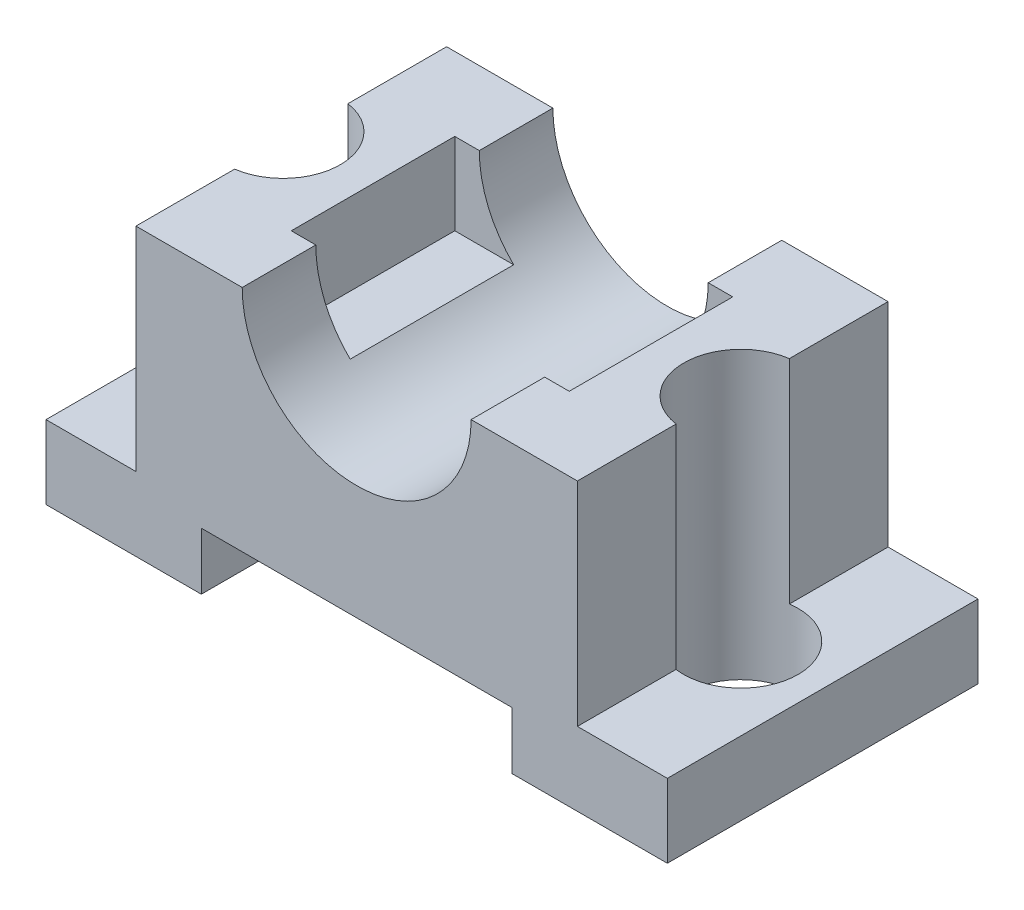
ISO-10303-21;
HEADER;
FILE_DESCRIPTION(('STEP AP214'),'2;1');
FILE_NAME('part.step','',(''),(''),'','','');
FILE_SCHEMA(('AUTOMOTIVE_DESIGN { 1 0 10303 214 1 1 1 1 }'));
ENDSEC;
DATA;
#1=APPLICATION_CONTEXT('core data for automotive mechanical design processes');
#2=APPLICATION_PROTOCOL_DEFINITION('international standard','automotive_design',2000,#1);
#3=PRODUCT_CONTEXT('',#1,'mechanical');
#4=PRODUCT('Part','Part','',(#3));
#5=PRODUCT_RELATED_PRODUCT_CATEGORY('part','',(#4));
#6=PRODUCT_DEFINITION_FORMATION('','',#4);
#7=PRODUCT_DEFINITION_CONTEXT('part definition',#1,'design');
#8=PRODUCT_DEFINITION('design','',#6,#7);
#9=PRODUCT_DEFINITION_SHAPE('','',#8);
#10=(LENGTH_UNIT() NAMED_UNIT(*) SI_UNIT(.MILLI.,.METRE.));
#11=(NAMED_UNIT(*) PLANE_ANGLE_UNIT() SI_UNIT($,.RADIAN.));
#12=(NAMED_UNIT(*) SI_UNIT($,.STERADIAN.) SOLID_ANGLE_UNIT());
#13=UNCERTAINTY_MEASURE_WITH_UNIT(LENGTH_MEASURE(1.E-05),#10,'distance_accuracy_value','');
#14=(GEOMETRIC_REPRESENTATION_CONTEXT(3) GLOBAL_UNCERTAINTY_ASSIGNED_CONTEXT((#13)) GLOBAL_UNIT_ASSIGNED_CONTEXT((#10,
#11,#12)) REPRESENTATION_CONTEXT('',''));
#15=CARTESIAN_POINT('',(0.,0.,0.));
#16=DIRECTION('',(0.,0.,1.));
#17=DIRECTION('',(1.,0.,0.));
#18=AXIS2_PLACEMENT_3D('',#15,#16,#17);
#19=CARTESIAN_POINT('',(0.,35.,19.));
#20=DIRECTION('',(0.,0.,-1.));
#21=DIRECTION('',(-1.,0.,0.));
#22=AXIS2_PLACEMENT_3D('',#19,#20,#21);
#23=CYLINDRICAL_SURFACE('',#22,14.);
#24=DIRECTION('',(0.,0.,-1.));
#25=VECTOR('',#24,1.);
#26=CARTESIAN_POINT('',(-14.,35.,19.));
#27=LINE('',#26,#25);
#28=CARTESIAN_POINT('',(-14.,35.,-10.));
#29=VERTEX_POINT('',#28);
#30=CARTESIAN_POINT('',(-14.,35.,-19.));
#31=VERTEX_POINT('',#30);
#32=EDGE_CURVE('E469',#29,#31,#27,.T.);
#33=ORIENTED_EDGE('',*,*,#32,.F.);
#34=CARTESIAN_POINT('',(0.,35.,-10.));
#35=DIRECTION('',(0.,0.,1.));
#36=DIRECTION('',(1.,0.,0.));
#37=AXIS2_PLACEMENT_3D('',#34,#35,#36);
#38=CIRCLE('',#37,14.);
#39=CARTESIAN_POINT('',(-9.79795897113273,25.,-10.));
#40=VERTEX_POINT('',#39);
#41=EDGE_CURVE('E276',#29,#40,#38,.T.);
#42=ORIENTED_EDGE('',*,*,#41,.T.);
#43=DIRECTION('',(0.,0.,-1.));
#44=VECTOR('',#43,1.);
#45=CARTESIAN_POINT('',(-9.79795897113273,25.,19.));
#46=LINE('',#45,#44);
#47=CARTESIAN_POINT('',(-9.79795897113273,25.,9.99999999999999));
#48=VERTEX_POINT('',#47);
#49=EDGE_CURVE('E11',#48,#40,#46,.T.);
#50=ORIENTED_EDGE('',*,*,#49,.F.);
#51=CARTESIAN_POINT('',(0.,35.,9.99999999999999));
#52=DIRECTION('',(0.,0.,-1.));
#53=DIRECTION('',(-1.,0.,0.));
#54=AXIS2_PLACEMENT_3D('',#51,#52,#53);
#55=CIRCLE('',#54,14.);
#56=CARTESIAN_POINT('',(-14.,35.,9.99999999999999));
#57=VERTEX_POINT('',#56);
#58=EDGE_CURVE('E269',#48,#57,#55,.T.);
#59=ORIENTED_EDGE('',*,*,#58,.T.);
#60=CARTESIAN_POINT('',(-14.,35.,19.));
#61=VERTEX_POINT('',#60);
#62=EDGE_CURVE('E470',#61,#57,#27,.T.);
#63=ORIENTED_EDGE('',*,*,#62,.F.);
#64=CARTESIAN_POINT('',(0.,35.,19.));
#65=DIRECTION('',(0.,0.,1.));
#66=DIRECTION('',(1.,0.,0.));
#67=AXIS2_PLACEMENT_3D('',#64,#65,#66);
#68=CIRCLE('',#67,14.);
#69=CARTESIAN_POINT('',(14.,35.,19.));
#70=VERTEX_POINT('',#69);
#71=EDGE_CURVE('E316',#61,#70,#68,.T.);
#72=ORIENTED_EDGE('',*,*,#71,.T.);
#73=DIRECTION('',(0.,0.,-1.));
#74=VECTOR('',#73,1.);
#75=CARTESIAN_POINT('',(14.,35.,19.));
#76=LINE('',#75,#74);
#77=CARTESIAN_POINT('',(14.,35.,9.99999999999999));
#78=VERTEX_POINT('',#77);
#79=EDGE_CURVE('E419',#70,#78,#76,.T.);
#80=ORIENTED_EDGE('',*,*,#79,.T.);
#81=CARTESIAN_POINT('',(9.79795897113272,25.,9.99999999999999));
#82=VERTEX_POINT('',#81);
#83=EDGE_CURVE('E70',#78,#82,#55,.T.);
#84=ORIENTED_EDGE('',*,*,#83,.T.);
#85=DIRECTION('',(0.,0.,-1.));
#86=VECTOR('',#85,1.);
#87=CARTESIAN_POINT('',(9.79795897113272,25.,19.));
#88=LINE('',#87,#86);
#89=CARTESIAN_POINT('',(9.79795897113272,25.,-10.));
#90=VERTEX_POINT('',#89);
#91=EDGE_CURVE('E55',#90,#82,#88,.F.);
#92=ORIENTED_EDGE('',*,*,#91,.F.);
#93=CARTESIAN_POINT('',(14.,35.,-10.));
#94=VERTEX_POINT('',#93);
#95=EDGE_CURVE('E237',#90,#94,#38,.T.);
#96=ORIENTED_EDGE('',*,*,#95,.T.);
#97=CARTESIAN_POINT('',(14.,35.,-19.));
#98=VERTEX_POINT('',#97);
#99=EDGE_CURVE('E366',#94,#98,#76,.T.);
#100=ORIENTED_EDGE('',*,*,#99,.T.);
#101=CARTESIAN_POINT('',(0.,35.,-19.));
#102=DIRECTION('',(0.,0.,1.));
#103=DIRECTION('',(1.,0.,0.));
#104=AXIS2_PLACEMENT_3D('',#101,#102,#103);
#105=CIRCLE('',#104,14.);
#106=EDGE_CURVE('E315',#31,#98,#105,.T.);
#107=ORIENTED_EDGE('',*,*,#106,.F.);
#108=EDGE_LOOP('',(#33,#42,#50,#59,#63,#72,#80,#84,#92,#96,#100,#107));
#109=FACE_BOUND('',#108,.T.);
#110=ADVANCED_FACE('F47',(#109),#23,.F.);
#111=CARTESIAN_POINT('',(0.,35.,19.));
#112=DIRECTION('',(0.,1.,0.));
#113=DIRECTION('',(-1.,0.,0.));
#114=AXIS2_PLACEMENT_3D('',#111,#112,#113);
#115=PLANE('',#114);
#116=DIRECTION('',(0.,0.,-1.));
#117=VECTOR('',#116,1.);
#118=CARTESIAN_POINT('',(-17.,35.,19.));
#119=LINE('',#118,#117);
#120=CARTESIAN_POINT('',(-17.,35.,9.99999999999999));
#121=VERTEX_POINT('',#120);
#122=CARTESIAN_POINT('',(-17.,35.,-10.));
#123=VERTEX_POINT('',#122);
#124=EDGE_CURVE('E482',#121,#123,#119,.T.);
#125=ORIENTED_EDGE('',*,*,#124,.T.);
#126=DIRECTION('',(1.,0.,0.));
#127=VECTOR('',#126,1.);
#128=CARTESIAN_POINT('',(0.,35.,-10.));
#129=LINE('',#128,#127);
#130=EDGE_CURVE('E275',#123,#29,#129,.T.);
#131=ORIENTED_EDGE('',*,*,#130,.T.);
#132=ORIENTED_EDGE('',*,*,#32,.T.);
#133=DIRECTION('',(1.,0.,0.));
#134=VECTOR('',#133,1.);
#135=CARTESIAN_POINT('',(0.,35.,-19.));
#136=LINE('',#135,#134);
#137=CARTESIAN_POINT('',(-27.,35.,-19.));
#138=VERTEX_POINT('',#137);
#139=EDGE_CURVE('E370',#138,#31,#136,.T.);
#140=ORIENTED_EDGE('',*,*,#139,.F.);
#141=DIRECTION('',(0.,0.,-1.));
#142=VECTOR('',#141,1.);
#143=CARTESIAN_POINT('',(-27.,35.,19.));
#144=LINE('',#143,#142);
#145=CARTESIAN_POINT('',(-27.,35.,-6.92820323027551));
#146=VERTEX_POINT('',#145);
#147=EDGE_CURVE('E464',#146,#138,#144,.T.);
#148=ORIENTED_EDGE('',*,*,#147,.F.);
#149=CARTESIAN_POINT('',(-28.,35.,0.));
#150=DIRECTION('',(0.,1.,0.));
#151=DIRECTION('',(0.,0.,-1.));
#152=AXIS2_PLACEMENT_3D('',#149,#150,#151);
#153=CIRCLE('',#152,7.);
#154=CARTESIAN_POINT('',(-27.,35.,6.92820323027551));
#155=VERTEX_POINT('',#154);
#156=EDGE_CURVE('E284',#155,#146,#153,.T.);
#157=ORIENTED_EDGE('',*,*,#156,.F.);
#158=CARTESIAN_POINT('',(-27.,35.,19.));
#159=VERTEX_POINT('',#158);
#160=EDGE_CURVE('E465',#159,#155,#144,.T.);
#161=ORIENTED_EDGE('',*,*,#160,.F.);
#162=DIRECTION('',(1.,0.,0.));
#163=VECTOR('',#162,1.);
#164=CARTESIAN_POINT('',(0.,35.,19.));
#165=LINE('',#164,#163);
#166=EDGE_CURVE('E320',#159,#61,#165,.T.);
#167=ORIENTED_EDGE('',*,*,#166,.T.);
#168=ORIENTED_EDGE('',*,*,#62,.T.);
#169=DIRECTION('',(-1.,0.,0.));
#170=VECTOR('',#169,1.);
#171=CARTESIAN_POINT('',(0.,35.,9.99999999999999));
#172=LINE('',#171,#170);
#173=EDGE_CURVE('E268',#57,#121,#172,.T.);
#174=ORIENTED_EDGE('',*,*,#173,.T.);
#175=EDGE_LOOP('',(#125,#131,#132,#140,#148,#157,#161,#167,#168,#174));
#176=FACE_BOUND('',#175,.T.);
#177=ADVANCED_FACE('F509',(#176),#115,.T.);
#178=CARTESIAN_POINT('',(0.,35.,19.));
#179=DIRECTION('',(0.,-1.,0.));
#180=DIRECTION('',(1.,0.,0.));
#181=AXIS2_PLACEMENT_3D('',#178,#179,#180);
#182=PLANE('',#181);
#183=DIRECTION('',(-1.,0.,0.));
#184=VECTOR('',#183,1.);
#185=CARTESIAN_POINT('',(0.,35.,-10.));
#186=LINE('',#185,#184);
#187=CARTESIAN_POINT('',(17.,35.,-10.));
#188=VERTEX_POINT('',#187);
#189=EDGE_CURVE('E479',#188,#94,#186,.T.);
#190=ORIENTED_EDGE('',*,*,#189,.F.);
#191=DIRECTION('',(0.,0.,-1.));
#192=VECTOR('',#191,1.);
#193=CARTESIAN_POINT('',(17.,35.,19.));
#194=LINE('',#193,#192);
#195=CARTESIAN_POINT('',(17.,35.,9.99999999999999));
#196=VERTEX_POINT('',#195);
#197=EDGE_CURVE('E227',#196,#188,#194,.T.);
#198=ORIENTED_EDGE('',*,*,#197,.F.);
#199=DIRECTION('',(1.,0.,0.));
#200=VECTOR('',#199,1.);
#201=CARTESIAN_POINT('',(0.,35.,9.99999999999999));
#202=LINE('',#201,#200);
#203=EDGE_CURVE('E474',#78,#196,#202,.T.);
#204=ORIENTED_EDGE('',*,*,#203,.F.);
#205=ORIENTED_EDGE('',*,*,#79,.F.);
#206=DIRECTION('',(-1.,0.,0.));
#207=VECTOR('',#206,1.);
#208=CARTESIAN_POINT('',(0.,35.,19.));
#209=LINE('',#208,#207);
#210=CARTESIAN_POINT('',(27.,35.,19.));
#211=VERTEX_POINT('',#210);
#212=EDGE_CURVE('E363',#211,#70,#209,.T.);
#213=ORIENTED_EDGE('',*,*,#212,.F.);
#214=DIRECTION('',(0.,0.,-1.));
#215=VECTOR('',#214,1.);
#216=CARTESIAN_POINT('',(27.,35.,19.));
#217=LINE('',#216,#215);
#218=CARTESIAN_POINT('',(27.,35.,6.92820323027551));
#219=VERTEX_POINT('',#218);
#220=EDGE_CURVE('E424',#211,#219,#217,.T.);
#221=ORIENTED_EDGE('',*,*,#220,.T.);
#222=CARTESIAN_POINT('',(28.,35.,0.));
#223=DIRECTION('',(0.,1.,0.));
#224=DIRECTION('',(0.,0.,1.));
#225=AXIS2_PLACEMENT_3D('',#222,#223,#224);
#226=CIRCLE('',#225,7.);
#227=CARTESIAN_POINT('',(27.,35.,-6.92820323027551));
#228=VERTEX_POINT('',#227);
#229=EDGE_CURVE('E280',#228,#219,#226,.T.);
#230=ORIENTED_EDGE('',*,*,#229,.F.);
#231=CARTESIAN_POINT('',(27.,35.,-19.));
#232=VERTEX_POINT('',#231);
#233=EDGE_CURVE('E423',#228,#232,#217,.T.);
#234=ORIENTED_EDGE('',*,*,#233,.T.);
#235=DIRECTION('',(-1.,0.,0.));
#236=VECTOR('',#235,1.);
#237=CARTESIAN_POINT('',(0.,35.,-19.));
#238=LINE('',#237,#236);
#239=EDGE_CURVE('E321',#232,#98,#238,.T.);
#240=ORIENTED_EDGE('',*,*,#239,.T.);
#241=ORIENTED_EDGE('',*,*,#99,.F.);
#242=EDGE_LOOP('',(#190,#198,#204,#205,#213,#221,#230,#234,#240,#241));
#243=FACE_BOUND('',#242,.T.);
#244=ADVANCED_FACE('F494',(#243),#182,.F.);
#245=CARTESIAN_POINT('',(-27.,0.,19.));
#246=DIRECTION('',(-1.,0.,0.));
#247=DIRECTION('',(0.,0.,1.));
#248=AXIS2_PLACEMENT_3D('',#245,#246,#247);
#249=PLANE('',#248);
#250=DIRECTION('',(0.,1.,0.));
#251=VECTOR('',#250,1.);
#252=CARTESIAN_POINT('',(-27.,0.,6.92820323027551));
#253=LINE('',#252,#251);
#254=CARTESIAN_POINT('',(-27.,9.,6.92820323027551));
#255=VERTEX_POINT('',#254);
#256=EDGE_CURVE('E312',#255,#155,#253,.T.);
#257=ORIENTED_EDGE('',*,*,#256,.F.);
#258=DIRECTION('',(0.,0.,-1.));
#259=VECTOR('',#258,1.);
#260=CARTESIAN_POINT('',(-27.,9.,19.));
#261=LINE('',#260,#259);
#262=CARTESIAN_POINT('',(-27.,9.,19.));
#263=VERTEX_POINT('',#262);
#264=EDGE_CURVE('E460',#263,#255,#261,.T.);
#265=ORIENTED_EDGE('',*,*,#264,.F.);
#266=DIRECTION('',(0.,1.,0.));
#267=VECTOR('',#266,1.);
#268=CARTESIAN_POINT('',(-27.,0.,19.));
#269=LINE('',#268,#267);
#270=EDGE_CURVE('E325',#263,#159,#269,.T.);
#271=ORIENTED_EDGE('',*,*,#270,.T.);
#272=ORIENTED_EDGE('',*,*,#160,.T.);
#273=EDGE_LOOP('',(#257,#265,#271,#272));
#274=FACE_BOUND('',#273,.T.);
#275=ADVANCED_FACE('F527',(#274),#249,.T.);
#276=CARTESIAN_POINT('',(27.,0.,19.));
#277=DIRECTION('',(-1.,0.,0.));
#278=DIRECTION('',(0.,0.,1.));
#279=AXIS2_PLACEMENT_3D('',#276,#277,#278);
#280=PLANE('',#279);
#281=DIRECTION('',(0.,0.,-1.));
#282=VECTOR('',#281,1.);
#283=CARTESIAN_POINT('',(27.,9.,19.));
#284=LINE('',#283,#282);
#285=CARTESIAN_POINT('',(27.,9.,19.));
#286=VERTEX_POINT('',#285);
#287=CARTESIAN_POINT('',(27.,9.,6.92820323027551));
#288=VERTEX_POINT('',#287);
#289=EDGE_CURVE('E429',#286,#288,#284,.T.);
#290=ORIENTED_EDGE('',*,*,#289,.T.);
#291=DIRECTION('',(0.,1.,0.));
#292=VECTOR('',#291,1.);
#293=CARTESIAN_POINT('',(27.,0.,6.92820323027551));
#294=LINE('',#293,#292);
#295=EDGE_CURVE('E301',#288,#219,#294,.T.);
#296=ORIENTED_EDGE('',*,*,#295,.T.);
#297=ORIENTED_EDGE('',*,*,#220,.F.);
#298=DIRECTION('',(0.,1.,0.));
#299=VECTOR('',#298,1.);
#300=CARTESIAN_POINT('',(27.,0.,19.));
#301=LINE('',#300,#299);
#302=EDGE_CURVE('E360',#286,#211,#301,.T.);
#303=ORIENTED_EDGE('',*,*,#302,.F.);
#304=EDGE_LOOP('',(#290,#296,#297,#303));
#305=FACE_BOUND('',#304,.T.);
#306=ADVANCED_FACE('F572',(#305),#280,.F.);
#307=DIRECTION('',(0.,1.,0.));
#308=VECTOR('',#307,1.);
#309=CARTESIAN_POINT('',(-27.,0.,-6.92820323027551));
#310=LINE('',#309,#308);
#311=CARTESIAN_POINT('',(-27.,9.,-6.92820323027551));
#312=VERTEX_POINT('',#311);
#313=EDGE_CURVE('E309',#146,#312,#310,.F.);
#314=ORIENTED_EDGE('',*,*,#313,.F.);
#315=ORIENTED_EDGE('',*,*,#147,.T.);
#316=DIRECTION('',(0.,1.,0.));
#317=VECTOR('',#316,1.);
#318=CARTESIAN_POINT('',(-27.,0.,-19.));
#319=LINE('',#318,#317);
#320=CARTESIAN_POINT('',(-27.,9.,-19.));
#321=VERTEX_POINT('',#320);
#322=EDGE_CURVE('E374',#321,#138,#319,.T.);
#323=ORIENTED_EDGE('',*,*,#322,.F.);
#324=EDGE_CURVE('E459',#312,#321,#261,.T.);
#325=ORIENTED_EDGE('',*,*,#324,.F.);
#326=EDGE_LOOP('',(#314,#315,#323,#325));
#327=FACE_BOUND('',#326,.T.);
#328=ADVANCED_FACE('F580',(#327),#249,.T.);
#329=CARTESIAN_POINT('',(0.,9.,19.));
#330=DIRECTION('',(0.,-1.,0.));
#331=DIRECTION('',(0.,0.,-1.));
#332=AXIS2_PLACEMENT_3D('',#329,#330,#331);
#333=PLANE('',#332);
#334=ORIENTED_EDGE('',*,*,#264,.T.);
#335=CARTESIAN_POINT('',(-28.,9.,0.));
#336=DIRECTION('',(0.,-1.,0.));
#337=DIRECTION('',(0.,0.,-1.));
#338=AXIS2_PLACEMENT_3D('',#335,#336,#337);
#339=CIRCLE('',#338,7.);
#340=EDGE_CURVE('E305',#255,#312,#339,.T.);
#341=ORIENTED_EDGE('',*,*,#340,.T.);
#342=ORIENTED_EDGE('',*,*,#324,.T.);
#343=DIRECTION('',(-1.,0.,0.));
#344=VECTOR('',#343,1.);
#345=CARTESIAN_POINT('',(0.,9.,-19.));
#346=LINE('',#345,#344);
#347=CARTESIAN_POINT('',(-38.,9.,-19.));
#348=VERTEX_POINT('',#347);
#349=EDGE_CURVE('E378',#321,#348,#346,.T.);
#350=ORIENTED_EDGE('',*,*,#349,.T.);
#351=DIRECTION('',(0.,0.,-1.));
#352=VECTOR('',#351,1.);
#353=CARTESIAN_POINT('',(-38.,9.,19.));
#354=LINE('',#353,#352);
#355=CARTESIAN_POINT('',(-38.,9.,19.));
#356=VERTEX_POINT('',#355);
#357=EDGE_CURVE('E456',#356,#348,#354,.T.);
#358=ORIENTED_EDGE('',*,*,#357,.F.);
#359=DIRECTION('',(-1.,0.,0.));
#360=VECTOR('',#359,1.);
#361=CARTESIAN_POINT('',(0.,9.,19.));
#362=LINE('',#361,#360);
#363=EDGE_CURVE('E329',#263,#356,#362,.T.);
#364=ORIENTED_EDGE('',*,*,#363,.F.);
#365=EDGE_LOOP('',(#334,#341,#342,#350,#358,#364));
#366=FACE_BOUND('',#365,.T.);
#367=ADVANCED_FACE('F531',(#366),#333,.F.);
#368=CARTESIAN_POINT('',(-38.,0.,19.));
#369=DIRECTION('',(-1.,0.,0.));
#370=DIRECTION('',(0.,0.,1.));
#371=AXIS2_PLACEMENT_3D('',#368,#369,#370);
#372=PLANE('',#371);
#373=DIRECTION('',(0.,1.,0.));
#374=VECTOR('',#373,1.);
#375=CARTESIAN_POINT('',(-38.,0.,-19.));
#376=LINE('',#375,#374);
#377=CARTESIAN_POINT('',(-38.,0.,-19.));
#378=VERTEX_POINT('',#377);
#379=EDGE_CURVE('E382',#378,#348,#376,.T.);
#380=ORIENTED_EDGE('',*,*,#379,.F.);
#381=DIRECTION('',(0.,0.,-1.));
#382=VECTOR('',#381,1.);
#383=CARTESIAN_POINT('',(-38.,0.,19.));
#384=LINE('',#383,#382);
#385=CARTESIAN_POINT('',(-38.,0.,19.));
#386=VERTEX_POINT('',#385);
#387=EDGE_CURVE('E453',#386,#378,#384,.T.);
#388=ORIENTED_EDGE('',*,*,#387,.F.);
#389=DIRECTION('',(0.,1.,0.));
#390=VECTOR('',#389,1.);
#391=CARTESIAN_POINT('',(-38.,0.,19.));
#392=LINE('',#391,#390);
#393=EDGE_CURVE('E332',#386,#356,#392,.T.);
#394=ORIENTED_EDGE('',*,*,#393,.T.);
#395=ORIENTED_EDGE('',*,*,#357,.T.);
#396=EDGE_LOOP('',(#380,#388,#394,#395));
#397=FACE_BOUND('',#396,.T.);
#398=ADVANCED_FACE('F576',(#397),#372,.T.);
#399=CARTESIAN_POINT('',(0.,0.,19.));
#400=DIRECTION('',(0.,-1.,0.));
#401=DIRECTION('',(1.,0.,0.));
#402=AXIS2_PLACEMENT_3D('',#399,#400,#401);
#403=PLANE('',#402);
#404=CARTESIAN_POINT('',(-28.,0.,0.));
#405=DIRECTION('',(0.,1.,0.));
#406=DIRECTION('',(0.,0.,-1.));
#407=AXIS2_PLACEMENT_3D('',#404,#405,#406);
#408=CIRCLE('',#407,7.);
#409=CARTESIAN_POINT('',(-28.,0.,-7.));
#410=VERTEX_POINT('',#409);
#411=EDGE_CURVE('E289',#410,#410,#408,.T.);
#412=ORIENTED_EDGE('',*,*,#411,.T.);
#413=EDGE_LOOP('',(#412));
#414=FACE_BOUND('',#413,.T.);
#415=DIRECTION('',(-1.,0.,0.));
#416=VECTOR('',#415,1.);
#417=CARTESIAN_POINT('',(0.,0.,-19.));
#418=LINE('',#417,#416);
#419=CARTESIAN_POINT('',(-19.,0.,-19.));
#420=VERTEX_POINT('',#419);
#421=EDGE_CURVE('E386',#420,#378,#418,.T.);
#422=ORIENTED_EDGE('',*,*,#421,.F.);
#423=DIRECTION('',(0.,0.,-1.));
#424=VECTOR('',#423,1.);
#425=CARTESIAN_POINT('',(-19.,0.,19.));
#426=LINE('',#425,#424);
#427=CARTESIAN_POINT('',(-19.,0.,19.));
#428=VERTEX_POINT('',#427);
#429=EDGE_CURVE('E450',#428,#420,#426,.T.);
#430=ORIENTED_EDGE('',*,*,#429,.F.);
#431=DIRECTION('',(-1.,0.,0.));
#432=VECTOR('',#431,1.);
#433=CARTESIAN_POINT('',(0.,0.,19.));
#434=LINE('',#433,#432);
#435=EDGE_CURVE('E336',#428,#386,#434,.T.);
#436=ORIENTED_EDGE('',*,*,#435,.T.);
#437=ORIENTED_EDGE('',*,*,#387,.T.);
#438=EDGE_LOOP('',(#422,#430,#436,#437));
#439=FACE_BOUND('',#438,.T.);
#440=ADVANCED_FACE('F537',(#414,#439),#403,.T.);
#441=CARTESIAN_POINT('',(-19.,0.,19.));
#442=DIRECTION('',(-1.,0.,0.));
#443=DIRECTION('',(0.,0.,1.));
#444=AXIS2_PLACEMENT_3D('',#441,#442,#443);
#445=PLANE('',#444);
#446=DIRECTION('',(0.,1.,0.));
#447=VECTOR('',#446,1.);
#448=CARTESIAN_POINT('',(-19.,0.,-19.));
#449=LINE('',#448,#447);
#450=CARTESIAN_POINT('',(-19.,7.,-19.));
#451=VERTEX_POINT('',#450);
#452=EDGE_CURVE('E390',#420,#451,#449,.T.);
#453=ORIENTED_EDGE('',*,*,#452,.T.);
#454=DIRECTION('',(0.,0.,-1.));
#455=VECTOR('',#454,1.);
#456=CARTESIAN_POINT('',(-19.,7.,19.));
#457=LINE('',#456,#455);
#458=CARTESIAN_POINT('',(-19.,7.,19.));
#459=VERTEX_POINT('',#458);
#460=EDGE_CURVE('E446',#459,#451,#457,.T.);
#461=ORIENTED_EDGE('',*,*,#460,.F.);
#462=DIRECTION('',(0.,1.,0.));
#463=VECTOR('',#462,1.);
#464=CARTESIAN_POINT('',(-19.,0.,19.));
#465=LINE('',#464,#463);
#466=EDGE_CURVE('E340',#428,#459,#465,.T.);
#467=ORIENTED_EDGE('',*,*,#466,.F.);
#468=ORIENTED_EDGE('',*,*,#429,.T.);
#469=EDGE_LOOP('',(#453,#461,#467,#468));
#470=FACE_BOUND('',#469,.T.);
#471=ADVANCED_FACE('F543',(#470),#445,.F.);
#472=CARTESIAN_POINT('',(0.,7.,19.));
#473=DIRECTION('',(0.,1.,0.));
#474=DIRECTION('',(0.,0.,1.));
#475=AXIS2_PLACEMENT_3D('',#472,#473,#474);
#476=PLANE('',#475);
#477=DIRECTION('',(1.,0.,0.));
#478=VECTOR('',#477,1.);
#479=CARTESIAN_POINT('',(0.,7.,-19.));
#480=LINE('',#479,#478);
#481=CARTESIAN_POINT('',(19.,7.,-19.));
#482=VERTEX_POINT('',#481);
#483=EDGE_CURVE('E393',#451,#482,#480,.T.);
#484=ORIENTED_EDGE('',*,*,#483,.T.);
#485=DIRECTION('',(0.,0.,-1.));
#486=VECTOR('',#485,1.);
#487=CARTESIAN_POINT('',(19.,7.,19.));
#488=LINE('',#487,#486);
#489=CARTESIAN_POINT('',(19.,7.,19.));
#490=VERTEX_POINT('',#489);
#491=EDGE_CURVE('E443',#490,#482,#488,.T.);
#492=ORIENTED_EDGE('',*,*,#491,.F.);
#493=DIRECTION('',(1.,0.,0.));
#494=VECTOR('',#493,1.);
#495=CARTESIAN_POINT('',(0.,7.,19.));
#496=LINE('',#495,#494);
#497=EDGE_CURVE('E343',#459,#490,#496,.T.);
#498=ORIENTED_EDGE('',*,*,#497,.F.);
#499=ORIENTED_EDGE('',*,*,#460,.T.);
#500=EDGE_LOOP('',(#484,#492,#498,#499));
#501=FACE_BOUND('',#500,.T.);
#502=ADVANCED_FACE('F548',(#501),#476,.F.);
#503=CARTESIAN_POINT('',(19.,0.,19.));
#504=DIRECTION('',(-1.,0.,0.));
#505=DIRECTION('',(0.,0.,1.));
#506=AXIS2_PLACEMENT_3D('',#503,#504,#505);
#507=PLANE('',#506);
#508=DIRECTION('',(0.,1.,0.));
#509=VECTOR('',#508,1.);
#510=CARTESIAN_POINT('',(19.,0.,-19.));
#511=LINE('',#510,#509);
#512=CARTESIAN_POINT('',(19.,0.,-19.));
#513=VERTEX_POINT('',#512);
#514=EDGE_CURVE('E397',#513,#482,#511,.T.);
#515=ORIENTED_EDGE('',*,*,#514,.F.);
#516=DIRECTION('',(0.,0.,-1.));
#517=VECTOR('',#516,1.);
#518=CARTESIAN_POINT('',(19.,0.,19.));
#519=LINE('',#518,#517);
#520=CARTESIAN_POINT('',(19.,0.,19.));
#521=VERTEX_POINT('',#520);
#522=EDGE_CURVE('E440',#521,#513,#519,.T.);
#523=ORIENTED_EDGE('',*,*,#522,.F.);
#524=DIRECTION('',(0.,1.,0.));
#525=VECTOR('',#524,1.);
#526=CARTESIAN_POINT('',(19.,0.,19.));
#527=LINE('',#526,#525);
#528=EDGE_CURVE('E346',#521,#490,#527,.T.);
#529=ORIENTED_EDGE('',*,*,#528,.T.);
#530=ORIENTED_EDGE('',*,*,#491,.T.);
#531=EDGE_LOOP('',(#515,#523,#529,#530));
#532=FACE_BOUND('',#531,.T.);
#533=ADVANCED_FACE('F552',(#532),#507,.T.);
#534=CARTESIAN_POINT('',(0.,0.,19.));
#535=DIRECTION('',(0.,1.,0.));
#536=DIRECTION('',(-1.,0.,0.));
#537=AXIS2_PLACEMENT_3D('',#534,#535,#536);
#538=PLANE('',#537);
#539=CARTESIAN_POINT('',(28.,0.,0.));
#540=DIRECTION('',(0.,1.,0.));
#541=DIRECTION('',(0.,0.,1.));
#542=AXIS2_PLACEMENT_3D('',#539,#540,#541);
#543=CIRCLE('',#542,7.);
#544=CARTESIAN_POINT('',(28.,0.,7.));
#545=VERTEX_POINT('',#544);
#546=EDGE_CURVE('E283',#545,#545,#543,.T.);
#547=ORIENTED_EDGE('',*,*,#546,.T.);
#548=EDGE_LOOP('',(#547));
#549=FACE_BOUND('',#548,.T.);
#550=DIRECTION('',(1.,0.,0.));
#551=VECTOR('',#550,1.);
#552=CARTESIAN_POINT('',(0.,0.,-19.));
#553=LINE('',#552,#551);
#554=CARTESIAN_POINT('',(38.,0.,-19.));
#555=VERTEX_POINT('',#554);
#556=EDGE_CURVE('E401',#513,#555,#553,.T.);
#557=ORIENTED_EDGE('',*,*,#556,.T.);
#558=DIRECTION('',(0.,0.,-1.));
#559=VECTOR('',#558,1.);
#560=CARTESIAN_POINT('',(38.,0.,19.));
#561=LINE('',#560,#559);
#562=CARTESIAN_POINT('',(38.,0.,19.));
#563=VERTEX_POINT('',#562);
#564=EDGE_CURVE('E436',#563,#555,#561,.T.);
#565=ORIENTED_EDGE('',*,*,#564,.F.);
#566=DIRECTION('',(1.,0.,0.));
#567=VECTOR('',#566,1.);
#568=CARTESIAN_POINT('',(0.,0.,19.));
#569=LINE('',#568,#567);
#570=EDGE_CURVE('E350',#521,#563,#569,.T.);
#571=ORIENTED_EDGE('',*,*,#570,.F.);
#572=ORIENTED_EDGE('',*,*,#522,.T.);
#573=EDGE_LOOP('',(#557,#565,#571,#572));
#574=FACE_BOUND('',#573,.T.);
#575=ADVANCED_FACE('F557',(#549,#574),#538,.F.);
#576=CARTESIAN_POINT('',(38.,0.,19.));
#577=DIRECTION('',(-1.,0.,0.));
#578=DIRECTION('',(0.,0.,1.));
#579=AXIS2_PLACEMENT_3D('',#576,#577,#578);
#580=PLANE('',#579);
#581=DIRECTION('',(0.,1.,0.));
#582=VECTOR('',#581,1.);
#583=CARTESIAN_POINT('',(38.,0.,-19.));
#584=LINE('',#583,#582);
#585=CARTESIAN_POINT('',(38.,9.,-19.));
#586=VERTEX_POINT('',#585);
#587=EDGE_CURVE('E404',#555,#586,#584,.T.);
#588=ORIENTED_EDGE('',*,*,#587,.T.);
#589=DIRECTION('',(0.,0.,-1.));
#590=VECTOR('',#589,1.);
#591=CARTESIAN_POINT('',(38.,9.,19.));
#592=LINE('',#591,#590);
#593=CARTESIAN_POINT('',(38.,9.,19.));
#594=VERTEX_POINT('',#593);
#595=EDGE_CURVE('E433',#594,#586,#592,.T.);
#596=ORIENTED_EDGE('',*,*,#595,.F.);
#597=DIRECTION('',(0.,1.,0.));
#598=VECTOR('',#597,1.);
#599=CARTESIAN_POINT('',(38.,0.,19.));
#600=LINE('',#599,#598);
#601=EDGE_CURVE('E353',#563,#594,#600,.T.);
#602=ORIENTED_EDGE('',*,*,#601,.F.);
#603=ORIENTED_EDGE('',*,*,#564,.T.);
#604=EDGE_LOOP('',(#588,#596,#602,#603));
#605=FACE_BOUND('',#604,.T.);
#606=ADVANCED_FACE('F562',(#605),#580,.F.);
#607=CARTESIAN_POINT('',(0.,9.,19.));
#608=DIRECTION('',(0.,1.,0.));
#609=DIRECTION('',(0.,0.,1.));
#610=AXIS2_PLACEMENT_3D('',#607,#608,#609);
#611=PLANE('',#610);
#612=CARTESIAN_POINT('',(28.,9.,0.));
#613=DIRECTION('',(0.,1.,0.));
#614=DIRECTION('',(0.,0.,1.));
#615=AXIS2_PLACEMENT_3D('',#612,#613,#614);
#616=CIRCLE('',#615,7.);
#617=CARTESIAN_POINT('',(27.,9.,-6.92820323027551));
#618=VERTEX_POINT('',#617);
#619=EDGE_CURVE('E298',#288,#618,#616,.T.);
#620=ORIENTED_EDGE('',*,*,#619,.F.);
#621=ORIENTED_EDGE('',*,*,#289,.F.);
#622=DIRECTION('',(1.,0.,0.));
#623=VECTOR('',#622,1.);
#624=CARTESIAN_POINT('',(0.,9.,19.));
#625=LINE('',#624,#623);
#626=EDGE_CURVE('E356',#286,#594,#625,.T.);
#627=ORIENTED_EDGE('',*,*,#626,.T.);
#628=ORIENTED_EDGE('',*,*,#595,.T.);
#629=DIRECTION('',(1.,0.,0.));
#630=VECTOR('',#629,1.);
#631=CARTESIAN_POINT('',(0.,9.,-19.));
#632=LINE('',#631,#630);
#633=CARTESIAN_POINT('',(27.,9.,-19.));
#634=VERTEX_POINT('',#633);
#635=EDGE_CURVE('E408',#634,#586,#632,.T.);
#636=ORIENTED_EDGE('',*,*,#635,.F.);
#637=EDGE_CURVE('E428',#618,#634,#284,.T.);
#638=ORIENTED_EDGE('',*,*,#637,.F.);
#639=EDGE_LOOP('',(#620,#621,#627,#628,#636,#638));
#640=FACE_BOUND('',#639,.T.);
#641=ADVANCED_FACE('F567',(#640),#611,.T.);
#642=ORIENTED_EDGE('',*,*,#233,.F.);
#643=DIRECTION('',(0.,1.,0.));
#644=VECTOR('',#643,1.);
#645=CARTESIAN_POINT('',(27.,0.,-6.92820323027551));
#646=LINE('',#645,#644);
#647=EDGE_CURVE('E288',#228,#618,#646,.F.);
#648=ORIENTED_EDGE('',*,*,#647,.T.);
#649=ORIENTED_EDGE('',*,*,#637,.T.);
#650=DIRECTION('',(0.,1.,0.));
#651=VECTOR('',#650,1.);
#652=CARTESIAN_POINT('',(27.,0.,-19.));
#653=LINE('',#652,#651);
#654=EDGE_CURVE('E412',#634,#232,#653,.T.);
#655=ORIENTED_EDGE('',*,*,#654,.T.);
#656=EDGE_LOOP('',(#642,#648,#649,#655));
#657=FACE_BOUND('',#656,.T.);
#658=ADVANCED_FACE('F575',(#657),#280,.F.);
#659=CARTESIAN_POINT('',(0.,0.,19.));
#660=DIRECTION('',(0.,0.,1.));
#661=DIRECTION('',(1.,0.,0.));
#662=AXIS2_PLACEMENT_3D('',#659,#660,#661);
#663=PLANE('',#662);
#664=ORIENTED_EDGE('',*,*,#71,.F.);
#665=ORIENTED_EDGE('',*,*,#166,.F.);
#666=ORIENTED_EDGE('',*,*,#270,.F.);
#667=ORIENTED_EDGE('',*,*,#363,.T.);
#668=ORIENTED_EDGE('',*,*,#393,.F.);
#669=ORIENTED_EDGE('',*,*,#435,.F.);
#670=ORIENTED_EDGE('',*,*,#466,.T.);
#671=ORIENTED_EDGE('',*,*,#497,.T.);
#672=ORIENTED_EDGE('',*,*,#528,.F.);
#673=ORIENTED_EDGE('',*,*,#570,.T.);
#674=ORIENTED_EDGE('',*,*,#601,.T.);
#675=ORIENTED_EDGE('',*,*,#626,.F.);
#676=ORIENTED_EDGE('',*,*,#302,.T.);
#677=ORIENTED_EDGE('',*,*,#212,.T.);
#678=EDGE_LOOP('',(#664,#665,#666,#667,#668,#669,#670,#671,#672,#673,#674,#675,#676,#677));
#679=FACE_BOUND('',#678,.T.);
#680=ADVANCED_FACE('F524',(#679),#663,.T.);
#681=CARTESIAN_POINT('',(0.,0.,-19.));
#682=DIRECTION('',(0.,0.,1.));
#683=DIRECTION('',(1.,0.,0.));
#684=AXIS2_PLACEMENT_3D('',#681,#682,#683);
#685=PLANE('',#684);
#686=ORIENTED_EDGE('',*,*,#106,.T.);
#687=ORIENTED_EDGE('',*,*,#239,.F.);
#688=ORIENTED_EDGE('',*,*,#654,.F.);
#689=ORIENTED_EDGE('',*,*,#635,.T.);
#690=ORIENTED_EDGE('',*,*,#587,.F.);
#691=ORIENTED_EDGE('',*,*,#556,.F.);
#692=ORIENTED_EDGE('',*,*,#514,.T.);
#693=ORIENTED_EDGE('',*,*,#483,.F.);
#694=ORIENTED_EDGE('',*,*,#452,.F.);
#695=ORIENTED_EDGE('',*,*,#421,.T.);
#696=ORIENTED_EDGE('',*,*,#379,.T.);
#697=ORIENTED_EDGE('',*,*,#349,.F.);
#698=ORIENTED_EDGE('',*,*,#322,.T.);
#699=ORIENTED_EDGE('',*,*,#139,.T.);
#700=EDGE_LOOP('',(#686,#687,#688,#689,#690,#691,#692,#693,#694,#695,#696,#697,#698,#699));
#701=FACE_BOUND('',#700,.T.);
#702=ADVANCED_FACE('F503',(#701),#685,.F.);
#703=CARTESIAN_POINT('',(28.,0.,0.));
#704=DIRECTION('',(0.,1.,0.));
#705=DIRECTION('',(0.,0.,1.));
#706=AXIS2_PLACEMENT_3D('',#703,#704,#705);
#707=CYLINDRICAL_SURFACE('',#706,7.);
#708=ORIENTED_EDGE('',*,*,#546,.F.);
#709=EDGE_LOOP('',(#708));
#710=FACE_BOUND('',#709,.T.);
#711=ORIENTED_EDGE('',*,*,#619,.T.);
#712=ORIENTED_EDGE('',*,*,#647,.F.);
#713=ORIENTED_EDGE('',*,*,#229,.T.);
#714=ORIENTED_EDGE('',*,*,#295,.F.);
#715=EDGE_LOOP('',(#711,#712,#713,#714));
#716=FACE_BOUND('',#715,.T.);
#717=ADVANCED_FACE('F585',(#710,#716),#707,.F.);
#718=CARTESIAN_POINT('',(-28.,0.,0.));
#719=DIRECTION('',(0.,1.,0.));
#720=DIRECTION('',(0.,0.,1.));
#721=AXIS2_PLACEMENT_3D('',#718,#719,#720);
#722=CYLINDRICAL_SURFACE('',#721,7.);
#723=ORIENTED_EDGE('',*,*,#256,.T.);
#724=ORIENTED_EDGE('',*,*,#156,.T.);
#725=ORIENTED_EDGE('',*,*,#313,.T.);
#726=ORIENTED_EDGE('',*,*,#340,.F.);
#727=EDGE_LOOP('',(#723,#724,#725,#726));
#728=FACE_BOUND('',#727,.T.);
#729=ORIENTED_EDGE('',*,*,#411,.F.);
#730=EDGE_LOOP('',(#729));
#731=FACE_BOUND('',#730,.T.);
#732=ADVANCED_FACE('F582',(#728,#731),#722,.F.);
#733=CARTESIAN_POINT('',(-17.,35.000012,-10.));
#734=DIRECTION('',(0.,0.,1.));
#735=DIRECTION('',(1.,0.,0.));
#736=AXIS2_PLACEMENT_3D('',#733,#734,#735);
#737=PLANE('',#736);
#738=DIRECTION('',(-1.,0.,0.));
#739=VECTOR('',#738,1.);
#740=CARTESIAN_POINT('',(-17.,25.,-10.));
#741=LINE('',#740,#739);
#742=CARTESIAN_POINT('',(17.,25.,-10.));
#743=VERTEX_POINT('',#742);
#744=EDGE_CURVE('E234',#743,#90,#741,.T.);
#745=ORIENTED_EDGE('',*,*,#744,.F.);
#746=DIRECTION('',(0.,-1.,0.));
#747=VECTOR('',#746,1.);
#748=CARTESIAN_POINT('',(17.,35.000012,-10.));
#749=LINE('',#748,#747);
#750=EDGE_CURVE('E220',#188,#743,#749,.T.);
#751=ORIENTED_EDGE('',*,*,#750,.F.);
#752=ORIENTED_EDGE('',*,*,#189,.T.);
#753=ORIENTED_EDGE('',*,*,#95,.F.);
#754=EDGE_LOOP('',(#745,#751,#752,#753));
#755=FACE_BOUND('',#754,.T.);
#756=ADVANCED_FACE('F235',(#755),#737,.T.);
#757=CARTESIAN_POINT('',(-17.,35.000012,9.99999999999999));
#758=DIRECTION('',(0.,0.,-1.));
#759=DIRECTION('',(-1.,0.,0.));
#760=AXIS2_PLACEMENT_3D('',#757,#758,#759);
#761=PLANE('',#760);
#762=ORIENTED_EDGE('',*,*,#203,.T.);
#763=DIRECTION('',(0.,-1.,0.));
#764=VECTOR('',#763,1.);
#765=CARTESIAN_POINT('',(17.,35.000012,9.99999999999999));
#766=LINE('',#765,#764);
#767=CARTESIAN_POINT('',(17.,25.,9.99999999999999));
#768=VERTEX_POINT('',#767);
#769=EDGE_CURVE('E259',#196,#768,#766,.T.);
#770=ORIENTED_EDGE('',*,*,#769,.T.);
#771=DIRECTION('',(1.,0.,0.));
#772=VECTOR('',#771,1.);
#773=CARTESIAN_POINT('',(-17.,25.,9.99999999999999));
#774=LINE('',#773,#772);
#775=EDGE_CURVE('E246',#82,#768,#774,.T.);
#776=ORIENTED_EDGE('',*,*,#775,.F.);
#777=ORIENTED_EDGE('',*,*,#83,.F.);
#778=EDGE_LOOP('',(#762,#770,#776,#777));
#779=FACE_BOUND('',#778,.T.);
#780=ADVANCED_FACE('F487',(#779),#761,.T.);
#781=CARTESIAN_POINT('',(17.,35.000012,9.99999999999999));
#782=DIRECTION('',(-1.,0.,0.));
#783=DIRECTION('',(0.,-1.,0.));
#784=AXIS2_PLACEMENT_3D('',#781,#782,#783);
#785=PLANE('',#784);
#786=ORIENTED_EDGE('',*,*,#197,.T.);
#787=ORIENTED_EDGE('',*,*,#750,.T.);
#788=DIRECTION('',(0.,0.,-1.));
#789=VECTOR('',#788,1.);
#790=CARTESIAN_POINT('',(17.,25.,9.99999999999999));
#791=LINE('',#790,#789);
#792=EDGE_CURVE('E225',#768,#743,#791,.T.);
#793=ORIENTED_EDGE('',*,*,#792,.F.);
#794=ORIENTED_EDGE('',*,*,#769,.F.);
#795=EDGE_LOOP('',(#786,#787,#793,#794));
#796=FACE_BOUND('',#795,.T.);
#797=ADVANCED_FACE('F222',(#796),#785,.T.);
#798=CARTESIAN_POINT('',(0.,25.,0.));
#799=DIRECTION('',(0.,-1.,0.));
#800=DIRECTION('',(1.,0.,0.));
#801=AXIS2_PLACEMENT_3D('',#798,#799,#800);
#802=PLANE('',#801);
#803=ORIENTED_EDGE('',*,*,#91,.T.);
#804=ORIENTED_EDGE('',*,*,#775,.T.);
#805=ORIENTED_EDGE('',*,*,#792,.T.);
#806=ORIENTED_EDGE('',*,*,#744,.T.);
#807=EDGE_LOOP('',(#803,#804,#805,#806));
#808=FACE_BOUND('',#807,.T.);
#809=ADVANCED_FACE('F245',(#808),#802,.F.);
#810=ORIENTED_EDGE('',*,*,#49,.T.);
#811=CARTESIAN_POINT('',(-17.,25.,-10.));
#812=VERTEX_POINT('',#811);
#813=EDGE_CURVE('E242',#40,#812,#741,.T.);
#814=ORIENTED_EDGE('',*,*,#813,.T.);
#815=DIRECTION('',(0.,0.,1.));
#816=VECTOR('',#815,1.);
#817=CARTESIAN_POINT('',(-17.,25.,9.99999999999999));
#818=LINE('',#817,#816);
#819=CARTESIAN_POINT('',(-17.,25.,9.99999999999999));
#820=VERTEX_POINT('',#819);
#821=EDGE_CURVE('E241',#812,#820,#818,.T.);
#822=ORIENTED_EDGE('',*,*,#821,.T.);
#823=EDGE_CURVE('E255',#820,#48,#774,.T.);
#824=ORIENTED_EDGE('',*,*,#823,.T.);
#825=EDGE_LOOP('',(#810,#814,#822,#824));
#826=FACE_BOUND('',#825,.T.);
#827=ADVANCED_FACE('F774',(#826),#802,.F.);
#828=ORIENTED_EDGE('',*,*,#130,.F.);
#829=DIRECTION('',(0.,-1.,0.));
#830=VECTOR('',#829,1.);
#831=CARTESIAN_POINT('',(-17.,35.000012,-10.));
#832=LINE('',#831,#830);
#833=EDGE_CURVE('E231',#123,#812,#832,.T.);
#834=ORIENTED_EDGE('',*,*,#833,.T.);
#835=ORIENTED_EDGE('',*,*,#813,.F.);
#836=ORIENTED_EDGE('',*,*,#41,.F.);
#837=EDGE_LOOP('',(#828,#834,#835,#836));
#838=FACE_BOUND('',#837,.T.);
#839=ADVANCED_FACE('F749',(#838),#737,.T.);
#840=ORIENTED_EDGE('',*,*,#823,.F.);
#841=DIRECTION('',(0.,-1.,0.));
#842=VECTOR('',#841,1.);
#843=CARTESIAN_POINT('',(-17.,35.000012,9.99999999999999));
#844=LINE('',#843,#842);
#845=EDGE_CURVE('E62',#121,#820,#844,.T.);
#846=ORIENTED_EDGE('',*,*,#845,.F.);
#847=ORIENTED_EDGE('',*,*,#173,.F.);
#848=ORIENTED_EDGE('',*,*,#58,.F.);
#849=EDGE_LOOP('',(#840,#846,#847,#848));
#850=FACE_BOUND('',#849,.T.);
#851=ADVANCED_FACE('F758',(#850),#761,.T.);
#852=CARTESIAN_POINT('',(-17.,35.000012,9.99999999999999));
#853=DIRECTION('',(1.,0.,0.));
#854=DIRECTION('',(0.,1.,0.));
#855=AXIS2_PLACEMENT_3D('',#852,#853,#854);
#856=PLANE('',#855);
#857=ORIENTED_EDGE('',*,*,#845,.T.);
#858=ORIENTED_EDGE('',*,*,#821,.F.);
#859=ORIENTED_EDGE('',*,*,#833,.F.);
#860=ORIENTED_EDGE('',*,*,#124,.F.);
#861=EDGE_LOOP('',(#857,#858,#859,#860));
#862=FACE_BOUND('',#861,.T.);
#863=ADVANCED_FACE('F799',(#862),#856,.T.);
#864=CLOSED_SHELL('',(#110,#177,#244,#275,#306,#328,#367,#398,#440,#471,#502,#533,#575,#606,
#641,#658,#680,#702,#717,#732,#756,#780,#797,#809,#827,#839,#851,#863));
#865=MANIFOLD_SOLID_BREP('B2',#864);
#866=ADVANCED_BREP_SHAPE_REPRESENTATION('',(#18,#865),#14);
#867=SHAPE_DEFINITION_REPRESENTATION(#9,#866);
ENDSEC;
END-ISO-10303-21;
